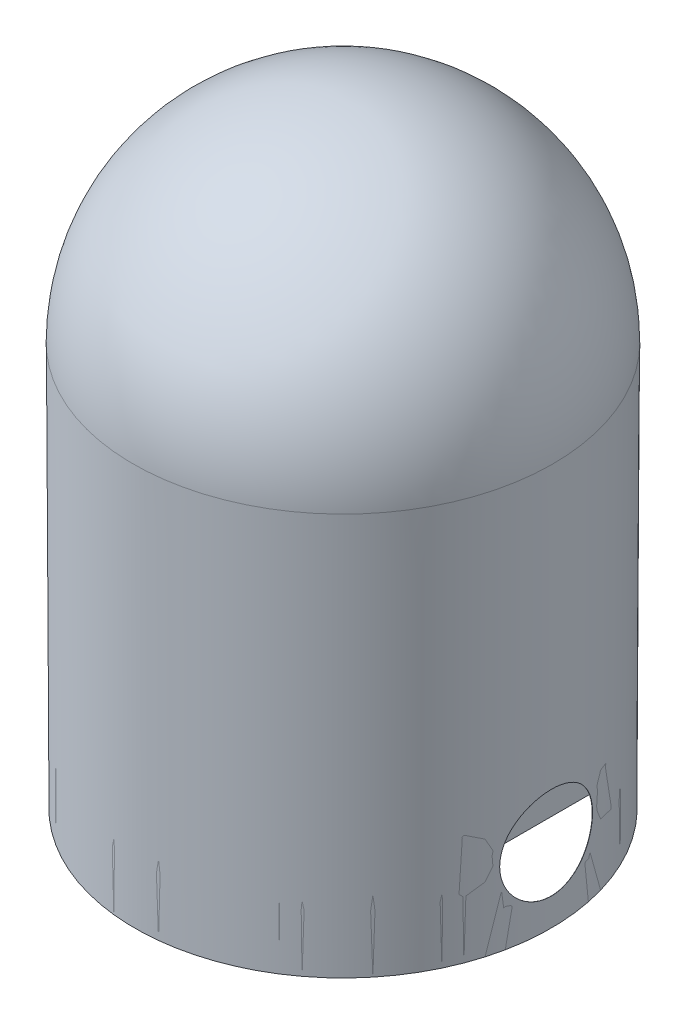
ISO-10303-21;
HEADER;
FILE_DESCRIPTION(('STEP AP214'),'2;1');
FILE_NAME('part.step','',(''),(''),'','','');
FILE_SCHEMA(('AUTOMOTIVE_DESIGN { 1 0 10303 214 1 1 1 1 }'));
ENDSEC;
DATA;
#1=APPLICATION_CONTEXT('core data for automotive mechanical design processes');
#2=APPLICATION_PROTOCOL_DEFINITION('international standard','automotive_design',2000,#1);
#3=PRODUCT_CONTEXT('',#1,'mechanical');
#4=PRODUCT('Part','Part','',(#3));
#5=PRODUCT_RELATED_PRODUCT_CATEGORY('part','',(#4));
#6=PRODUCT_DEFINITION_FORMATION('','',#4);
#7=PRODUCT_DEFINITION_CONTEXT('part definition',#1,'design');
#8=PRODUCT_DEFINITION('design','',#6,#7);
#9=PRODUCT_DEFINITION_SHAPE('','',#8);
#10=(LENGTH_UNIT() NAMED_UNIT(*) SI_UNIT(.MILLI.,.METRE.));
#11=(NAMED_UNIT(*) PLANE_ANGLE_UNIT() SI_UNIT($,.RADIAN.));
#12=(NAMED_UNIT(*) SI_UNIT($,.STERADIAN.) SOLID_ANGLE_UNIT());
#13=UNCERTAINTY_MEASURE_WITH_UNIT(LENGTH_MEASURE(1.E-05),#10,'distance_accuracy_value','');
#14=(GEOMETRIC_REPRESENTATION_CONTEXT(3) GLOBAL_UNCERTAINTY_ASSIGNED_CONTEXT((#13)) GLOBAL_UNIT_ASSIGNED_CONTEXT((#10,
#11,#12)) REPRESENTATION_CONTEXT('',''));
#15=CARTESIAN_POINT('',(0.,0.,0.));
#16=DIRECTION('',(0.,0.,1.));
#17=DIRECTION('',(1.,0.,0.));
#18=AXIS2_PLACEMENT_3D('',#15,#16,#17);
#19=CARTESIAN_POINT('',(0.,0.,0.));
#20=DIRECTION('',(0.,1.,0.));
#21=DIRECTION('',(0.,0.,1.));
#22=AXIS2_PLACEMENT_3D('',#19,#20,#21);
#23=PLANE('',#22);
#24=CARTESIAN_POINT('',(0.,0.,0.));
#25=DIRECTION('',(0.,-1.,0.));
#26=DIRECTION('',(0.,0.,-1.));
#27=AXIS2_PLACEMENT_3D('',#24,#25,#26);
#28=CIRCLE('',#27,14.224);
#29=CARTESIAN_POINT('',(2.54000000000001,0.,-13.9953769509792));
#30=VERTEX_POINT('',#29);
#31=CARTESIAN_POINT('',(7.62,0.,-12.0107358642175));
#32=VERTEX_POINT('',#31);
#33=EDGE_CURVE('E178',#30,#32,#28,.T.);
#34=ORIENTED_EDGE('',*,*,#33,.T.);
#35=DIRECTION('',(0.,0.,-1.));
#36=VECTOR('',#35,1.);
#37=CARTESIAN_POINT('',(7.62,0.,12.0107358642175));
#38=LINE('',#37,#36);
#39=CARTESIAN_POINT('',(7.62,0.,12.0107358642175));
#40=VERTEX_POINT('',#39);
#41=EDGE_CURVE('E135',#40,#32,#38,.T.);
#42=ORIENTED_EDGE('',*,*,#41,.F.);
#43=CARTESIAN_POINT('',(2.54,0.,13.9953769509792));
#44=VERTEX_POINT('',#43);
#45=EDGE_CURVE('E182',#40,#44,#28,.T.);
#46=ORIENTED_EDGE('',*,*,#45,.T.);
#47=DIRECTION('',(0.,0.,1.));
#48=VECTOR('',#47,1.);
#49=CARTESIAN_POINT('',(2.54,0.,13.9953769509792));
#50=LINE('',#49,#48);
#51=EDGE_CURVE('E151',#30,#44,#50,.T.);
#52=ORIENTED_EDGE('',*,*,#51,.F.);
#53=EDGE_LOOP('',(#34,#42,#46,#52));
#54=FACE_BOUND('',#53,.T.);
#55=ADVANCED_FACE('F35',(#54),#23,.F.);
#56=CARTESIAN_POINT('',(-2.54,0.,13.9953769509792));
#57=VERTEX_POINT('',#56);
#58=CARTESIAN_POINT('',(-7.62,0.,12.0107358642175));
#59=VERTEX_POINT('',#58);
#60=EDGE_CURVE('E401',#57,#59,#28,.T.);
#61=ORIENTED_EDGE('',*,*,#60,.T.);
#62=DIRECTION('',(0.,0.,1.));
#63=VECTOR('',#62,1.);
#64=CARTESIAN_POINT('',(-7.62,0.,12.0107358642175));
#65=LINE('',#64,#63);
#66=CARTESIAN_POINT('',(-7.62,0.,-12.0107358642175));
#67=VERTEX_POINT('',#66);
#68=EDGE_CURVE('E59',#67,#59,#65,.T.);
#69=ORIENTED_EDGE('',*,*,#68,.F.);
#70=CARTESIAN_POINT('',(-2.54,0.,-13.9953769509792));
#71=VERTEX_POINT('',#70);
#72=EDGE_CURVE('E172',#67,#71,#28,.T.);
#73=ORIENTED_EDGE('',*,*,#72,.T.);
#74=DIRECTION('',(0.,0.,-1.));
#75=VECTOR('',#74,1.);
#76=CARTESIAN_POINT('',(-2.54,0.,13.9953769509792));
#77=LINE('',#76,#75);
#78=EDGE_CURVE('E51',#57,#71,#77,.T.);
#79=ORIENTED_EDGE('',*,*,#78,.F.);
#80=EDGE_LOOP('',(#61,#69,#73,#79));
#81=FACE_BOUND('',#80,.T.);
#82=ADVANCED_FACE('F37',(#81),#23,.F.);
#83=CARTESIAN_POINT('',(0.,27.559,0.));
#84=DIRECTION('',(0.,-1.,0.));
#85=DIRECTION('',(-1.,0.,0.));
#86=AXIS2_PLACEMENT_3D('',#83,#84,#85);
#87=SPHERICAL_SURFACE('',#86,14.351);
#88=CARTESIAN_POINT('',(0.,27.559,0.));
#89=DIRECTION('',(0.,-1.,0.));
#90=DIRECTION('',(0.,0.,-1.));
#91=AXIS2_PLACEMENT_3D('',#88,#89,#90);
#92=CIRCLE('',#91,14.351);
#93=CARTESIAN_POINT('',(0.,27.559,-14.351));
#94=VERTEX_POINT('',#93);
#95=EDGE_CURVE('E181',#94,#94,#92,.T.);
#96=ORIENTED_EDGE('',*,*,#95,.F.);
#97=EDGE_LOOP('',(#96));
#98=FACE_BOUND('',#97,.T.);
#99=ADVANCED_FACE('F222',(#98),#87,.T.);
#100=CARTESIAN_POINT('',(0.,27.559,0.));
#101=DIRECTION('',(0.,1.,0.));
#102=DIRECTION('',(0.,0.,1.));
#103=AXIS2_PLACEMENT_3D('',#100,#101,#102);
#104=CONICAL_SURFACE('',#103,14.351,0.00460826231012028);
#105=CARTESIAN_POINT('',(14.0497008241268,2.89532698165526,-2.3038725665543));
#106=CARTESIAN_POINT('',(14.0691801413983,2.76617339641131,-2.18139446715179));
#107=CARTESIAN_POINT('',(14.0888518920256,2.64729976083629,-2.04800068410291));
#108=CARTESIAN_POINT('',(14.1263573665238,2.43341377098155,-1.76295051089078));
#109=CARTESIAN_POINT('',(14.144189857594,2.33841736039053,-1.61128201748954));
#110=CARTESIAN_POINT('',(14.1760050698291,2.17504353955398,-1.29373023481782));
#111=CARTESIAN_POINT('',(14.1899858694834,2.10667940845766,-1.12783990454742));
#112=CARTESIAN_POINT('',(14.2124853183673,1.99878667848915,-0.786610173351352));
#113=CARTESIAN_POINT('',(14.2210054280249,1.95925036940417,-0.611273312452413));
#114=CARTESIAN_POINT('',(14.2315258519271,1.91065016897221,-0.258873650042377));
#115=CARTESIAN_POINT('',(14.2336205069807,1.90114528259366,-0.0818744831295595));
#116=CARTESIAN_POINT('',(14.231320521346,1.91167759204344,0.271195743116567));
#117=CARTESIAN_POINT('',(14.226926127673,1.93171366335073,0.447266837522307));
#118=CARTESIAN_POINT('',(14.2122324197153,2.00026353118473,0.791375941732378));
#119=CARTESIAN_POINT('',(14.2020019862729,2.0484452900555,0.95948330656051));
#120=CARTESIAN_POINT('',(14.1768073501535,2.17153918305777,1.28522503562709));
#121=CARTESIAN_POINT('',(14.1618427670964,2.24645346516019,1.4428585570796));
#122=CARTESIAN_POINT('',(14.1285619961417,2.42207333165908,1.74559371404567));
#123=CARTESIAN_POINT('',(14.1102022775673,2.52312160591338,1.89049165174971));
#124=CARTESIAN_POINT('',(14.0722871741461,2.74771293482754,2.16149071667169));
#125=CARTESIAN_POINT('',(14.0527316335434,2.87125892397794,2.28758938789953));
#126=CARTESIAN_POINT('',(14.0142321460127,3.14008423087274,2.51981706878363));
#127=CARTESIAN_POINT('',(13.995306296375,3.28572448576985,2.62553182428115));
#128=CARTESIAN_POINT('',(13.9606818746617,3.59304133667862,2.81101140395865));
#129=CARTESIAN_POINT('',(13.9449831645575,3.75471724638812,2.89077733808476));
#130=CARTESIAN_POINT('',(13.9188073471691,4.08863970960474,3.02155436274061));
#131=CARTESIAN_POINT('',(13.9083006220708,4.26081985866895,3.07272877835894));
#132=CARTESIAN_POINT('',(13.8937145100689,4.61159315519827,3.14535933270135));
#133=CARTESIAN_POINT('',(13.8896340518137,4.79018522862406,3.16682042499395));
#134=CARTESIAN_POINT('',(13.8884845408357,5.14444218524899,3.17918011949429));
#135=CARTESIAN_POINT('',(13.8912611046524,5.32008348972589,3.17074984552197));
#136=CARTESIAN_POINT('',(13.9032393080903,5.66735261329487,3.12510986507102));
#137=CARTESIAN_POINT('',(13.9124408799015,5.83898047472532,3.08790046232877));
#138=CARTESIAN_POINT('',(13.9362212510777,6.17285351424144,2.9860777379085));
#139=CARTESIAN_POINT('',(13.9507818561938,6.33512831515081,2.92155702981745));
#140=CARTESIAN_POINT('',(13.9837109055119,6.64663841301904,2.76703968063862));
#141=CARTESIAN_POINT('',(14.0020798442875,6.79587201278534,2.67703973010384));
#142=CARTESIAN_POINT('',(14.0411018614368,7.08050533614093,2.4718488022663));
#143=CARTESIAN_POINT('',(14.0617954036713,7.21554073233196,2.35616001729031));
#144=CARTESIAN_POINT('',(14.1029060376351,7.46448350709255,2.10387147093172));
#145=CARTESIAN_POINT('',(14.1233231024535,7.57838884247704,1.96726968968191));
#146=CARTESIAN_POINT('',(14.1619552469046,7.78334275049572,1.6747756072605));
#147=CARTESIAN_POINT('',(14.180136949151,7.87406266094281,1.51864817899191));
#148=CARTESIAN_POINT('',(14.2119561030027,8.02788693737559,1.19290392495821));
#149=CARTESIAN_POINT('',(14.2255940475335,8.09099429911672,1.02328856489377));
#150=CARTESIAN_POINT('',(14.2466360252027,8.18685718378398,0.678005153090687));
#151=CARTESIAN_POINT('',(14.2541287559316,8.22004527175304,0.502462739679212));
#152=CARTESIAN_POINT('',(14.2623791510131,8.25653613387966,0.14815185320788));
#153=CARTESIAN_POINT('',(14.2631377238854,8.25984293938634,-0.0306161814155235));
#154=CARTESIAN_POINT('',(14.2578916499227,8.23670543890802,-0.382502486237278));
#155=CARTESIAN_POINT('',(14.2520219902008,8.21085494745931,-0.555662238678417));
#156=CARTESIAN_POINT('',(14.2343683084411,8.13119778634395,-0.895104454041886));
#157=CARTESIAN_POINT('',(14.2225841272374,8.07739036432599,-1.0613867317539));
#158=CARTESIAN_POINT('',(14.1942814762813,7.94316505780718,-1.38327905479009));
#159=CARTESIAN_POINT('',(14.1777418033964,7.86262773983603,-1.53883734625174));
#160=CARTESIAN_POINT('',(14.1416789660959,7.67731533785482,-1.83439737483622));
#161=CARTESIAN_POINT('',(14.1221553770825,7.57253680333705,-1.97439689311136));
#162=CARTESIAN_POINT('',(14.0816956100968,7.33894664065291,-2.23819377841141));
#163=CARTESIAN_POINT('',(14.0607375835067,7.20964914486582,-2.36155785487114));
#164=CARTESIAN_POINT('',(14.0200847090824,6.93209123888865,-2.58498068401012));
#165=CARTESIAN_POINT('',(14.0003899394761,6.7838296560358,-2.68503799441251));
#166=CARTESIAN_POINT('',(13.9643037968517,6.47113328297711,-2.85966272257627));
#167=CARTESIAN_POINT('',(13.9479379439594,6.30658694343021,-2.93403606221196));
#168=CARTESIAN_POINT('',(13.9205780382497,5.96688303076249,-3.05393059371665));
#169=CARTESIAN_POINT('',(13.9095830564026,5.79172729870379,-3.09945677584591));
#170=CARTESIAN_POINT('',(13.8943910990163,5.43942732826681,-3.15954794790237));
#171=CARTESIAN_POINT('',(13.8900654040231,5.26238893892933,-3.17470092395659));
#172=CARTESIAN_POINT('',(13.8882567105398,4.90821332533649,-3.17529022498424));
#173=CARTESIAN_POINT('',(13.8907738935643,4.73107609858396,-3.16072576167363));
#174=CARTESIAN_POINT('',(13.9021829332867,4.38470783066122,-3.10282915457713));
#175=CARTESIAN_POINT('',(13.910972914819,4.21539590500112,-3.05995756224739));
#176=CARTESIAN_POINT('',(13.9337362654291,3.88645483414481,-2.94724824765736));
#177=CARTESIAN_POINT('',(13.9477068581414,3.72682055577338,-2.87742496838249));
#178=CARTESIAN_POINT('',(13.9761856070528,3.45066422216324,-2.72866021554564));
#179=CARTESIAN_POINT('',(13.9900798733428,3.33173608571289,-2.65401700772292));
#180=CARTESIAN_POINT('',(14.0191766369608,3.10486059125785,-2.48979166817852));
#181=CARTESIAN_POINT('',(14.0343792037777,2.99691381718148,-2.40020874271281));
#182=CARTESIAN_POINT('',(14.0497008241268,2.89532698165526,-2.3038725665543));
#183=B_SPLINE_CURVE_WITH_KNOTS('',3,(#105,#106,#107,#108,#109,#110,#111,#112,#113,#114,#115,
#116,#117,#118,#119,#120,#121,#122,#123,#124,#125,#126,#127,#128,#129,#130,#131,#132,#133,#134,
#135,#136,#137,#138,#139,#140,#141,#142,#143,#144,#145,#146,#147,#148,#149,#150,#151,#152,#153,
#154,#155,#156,#157,#158,#159,#160,#161,#162,#163,#164,#165,#166,#167,#168,#169,#170,#171,#172,
#173,#174,#175,#176,#177,#178,#179,#180,#181,#182),.UNSPECIFIED.,.T.,.F.,(4,2,2,2,2,2,2,2,2,2,2,
2,2,2,2,2,2,2,2,2,2,2,2,2,2,2,2,2,2,2,2,2,2,2,2,2,2,2,4),(0.,0.536668477704947,1.07369436205403,
1.61098767177501,2.14813722568862,2.67736146861658,3.20656556634695,3.72964918180243,
4.2527748367418,4.78314248588757,5.31357936317985,5.85386501296566,6.39412754929915,
6.9312715037037,7.46832589896094,7.99339939748555,8.51846735443368,9.04176887410123,
9.56513839554863,10.0997064569918,10.6343261819305,11.176149595808,11.7179142113043,
12.2517143188429,12.7854424091669,13.3084938648801,13.8315593972039,14.3569942612491,
14.8825039620378,15.4197877975679,15.9571048726426,16.4983975717466,17.0395966072225,
17.5702134389128,18.1008443459147,18.623047964464,19.1449721299384,19.5670707882964,
19.989191879815),.UNSPECIFIED.);
#184=CARTESIAN_POINT('',(14.0497008241268,2.89532698165526,-2.3038725665543));
#185=VERTEX_POINT('',#184);
#186=EDGE_CURVE('E142',#185,#185,#183,.T.);
#187=ORIENTED_EDGE('',*,*,#186,.T.);
#188=EDGE_LOOP('',(#187));
#189=FACE_BOUND('',#188,.T.);
#190=ORIENTED_EDGE('',*,*,#33,.F.);
#191=CARTESIAN_POINT('',(0.,0.,0.));
#192=DIRECTION('',(0.,-1.,0.));
#193=DIRECTION('',(0.,0.,-1.));
#194=AXIS2_PLACEMENT_3D('',#191,#192,#193);
#195=CIRCLE('',#194,14.224);
#196=EDGE_CURVE('E165',#71,#30,#195,.T.);
#197=ORIENTED_EDGE('',*,*,#196,.F.);
#198=ORIENTED_EDGE('',*,*,#72,.F.);
#199=CARTESIAN_POINT('',(0.,0.,0.));
#200=DIRECTION('',(0.,-1.,0.));
#201=DIRECTION('',(0.,0.,-1.));
#202=AXIS2_PLACEMENT_3D('',#199,#200,#201);
#203=CIRCLE('',#202,14.224);
#204=EDGE_CURVE('E114',#59,#67,#203,.T.);
#205=ORIENTED_EDGE('',*,*,#204,.F.);
#206=ORIENTED_EDGE('',*,*,#60,.F.);
#207=CARTESIAN_POINT('',(0.,0.,0.));
#208=DIRECTION('',(0.,-1.,0.));
#209=DIRECTION('',(0.,0.,-1.));
#210=AXIS2_PLACEMENT_3D('',#207,#208,#209);
#211=CIRCLE('',#210,14.224);
#212=EDGE_CURVE('E129',#44,#57,#211,.T.);
#213=ORIENTED_EDGE('',*,*,#212,.F.);
#214=ORIENTED_EDGE('',*,*,#45,.F.);
#215=CARTESIAN_POINT('',(0.,0.,0.));
#216=DIRECTION('',(0.,-1.,0.));
#217=DIRECTION('',(0.,0.,-1.));
#218=AXIS2_PLACEMENT_3D('',#215,#216,#217);
#219=CIRCLE('',#218,14.224);
#220=EDGE_CURVE('E139',#32,#40,#219,.T.);
#221=ORIENTED_EDGE('',*,*,#220,.F.);
#222=EDGE_LOOP('',(#190,#197,#198,#205,#206,#213,#214,#221));
#223=FACE_BOUND('',#222,.T.);
#224=ORIENTED_EDGE('',*,*,#95,.T.);
#225=EDGE_LOOP('',(#224));
#226=FACE_BOUND('',#225,.T.);
#227=ADVANCED_FACE('F232',(#189,#223,#226),#104,.T.);
#228=CARTESIAN_POINT('',(0.,10.16,0.));
#229=DIRECTION('',(0.,-1.,0.));
#230=DIRECTION('',(0.,0.,-1.));
#231=AXIS2_PLACEMENT_3D('',#228,#229,#230);
#232=PLANE('',#231);
#233=CARTESIAN_POINT('',(0.,10.16,0.));
#234=DIRECTION('',(0.,-1.,0.));
#235=DIRECTION('',(0.,0.,-1.));
#236=AXIS2_PLACEMENT_3D('',#233,#234,#235);
#237=CIRCLE('',#236,2.54);
#238=CARTESIAN_POINT('',(-2.54,10.16,0.));
#239=VERTEX_POINT('',#238);
#240=CARTESIAN_POINT('',(2.54,10.16,0.));
#241=VERTEX_POINT('',#240);
#242=EDGE_CURVE('E11',#239,#241,#237,.F.);
#243=ORIENTED_EDGE('',*,*,#242,.T.);
#244=DIRECTION('',(0.,0.,1.));
#245=VECTOR('',#244,1.);
#246=CARTESIAN_POINT('',(2.54,10.16,13.9953769509792));
#247=LINE('',#246,#245);
#248=CARTESIAN_POINT('',(2.54,10.16,13.9953769509792));
#249=VERTEX_POINT('',#248);
#250=EDGE_CURVE('E158',#241,#249,#247,.T.);
#251=ORIENTED_EDGE('',*,*,#250,.T.);
#252=CARTESIAN_POINT('',(0.,10.16,0.));
#253=DIRECTION('',(0.,-1.,0.));
#254=DIRECTION('',(0.,0.,-1.));
#255=AXIS2_PLACEMENT_3D('',#252,#253,#254);
#256=CIRCLE('',#255,14.224);
#257=CARTESIAN_POINT('',(-2.54,10.16,13.9953769509792));
#258=VERTEX_POINT('',#257);
#259=EDGE_CURVE('E147',#249,#258,#256,.T.);
#260=ORIENTED_EDGE('',*,*,#259,.T.);
#261=DIRECTION('',(0.,0.,-1.));
#262=VECTOR('',#261,1.);
#263=CARTESIAN_POINT('',(-2.54,10.16,13.9953769509792));
#264=LINE('',#263,#262);
#265=EDGE_CURVE('E152',#258,#239,#264,.T.);
#266=ORIENTED_EDGE('',*,*,#265,.T.);
#267=EDGE_LOOP('',(#243,#251,#260,#266));
#268=FACE_BOUND('',#267,.T.);
#269=ADVANCED_FACE('F199',(#268),#232,.T.);
#270=EDGE_CURVE('E44',#241,#239,#237,.F.);
#271=ORIENTED_EDGE('',*,*,#270,.T.);
#272=CARTESIAN_POINT('',(-2.54,10.16,-13.9953769509792));
#273=VERTEX_POINT('',#272);
#274=EDGE_CURVE('E150',#239,#273,#264,.T.);
#275=ORIENTED_EDGE('',*,*,#274,.T.);
#276=CARTESIAN_POINT('',(0.,10.16,0.));
#277=DIRECTION('',(0.,-1.,0.));
#278=DIRECTION('',(0.,0.,-1.));
#279=AXIS2_PLACEMENT_3D('',#276,#277,#278);
#280=CIRCLE('',#279,14.224);
#281=CARTESIAN_POINT('',(2.54000000000001,10.16,-13.9953769509792));
#282=VERTEX_POINT('',#281);
#283=EDGE_CURVE('E155',#273,#282,#280,.T.);
#284=ORIENTED_EDGE('',*,*,#283,.T.);
#285=EDGE_CURVE('E159',#282,#241,#247,.T.);
#286=ORIENTED_EDGE('',*,*,#285,.T.);
#287=EDGE_LOOP('',(#271,#275,#284,#286));
#288=FACE_BOUND('',#287,.T.);
#289=ADVANCED_FACE('F190',(#288),#232,.T.);
#290=CARTESIAN_POINT('',(0.,10.16,0.));
#291=DIRECTION('',(0.,-1.,0.));
#292=DIRECTION('',(0.,0.,-1.));
#293=AXIS2_PLACEMENT_3D('',#290,#291,#292);
#294=CYLINDRICAL_SURFACE('',#293,14.224);
#295=ORIENTED_EDGE('',*,*,#212,.T.);
#296=DIRECTION('',(0.,-1.,0.));
#297=VECTOR('',#296,1.);
#298=CARTESIAN_POINT('',(-2.54,10.16,13.9953769509792));
#299=LINE('',#298,#297);
#300=EDGE_CURVE('E161',#258,#57,#299,.T.);
#301=ORIENTED_EDGE('',*,*,#300,.F.);
#302=ORIENTED_EDGE('',*,*,#259,.F.);
#303=DIRECTION('',(0.,-1.,0.));
#304=VECTOR('',#303,1.);
#305=CARTESIAN_POINT('',(2.54,10.16,13.9953769509792));
#306=LINE('',#305,#304);
#307=EDGE_CURVE('E170',#249,#44,#306,.T.);
#308=ORIENTED_EDGE('',*,*,#307,.T.);
#309=EDGE_LOOP('',(#295,#301,#302,#308));
#310=FACE_BOUND('',#309,.T.);
#311=ADVANCED_FACE('F286',(#310),#294,.F.);
#312=CARTESIAN_POINT('',(2.54,10.16,13.9953769509792));
#313=DIRECTION('',(1.,0.,0.));
#314=DIRECTION('',(0.,0.,-1.));
#315=AXIS2_PLACEMENT_3D('',#312,#313,#314);
#316=PLANE('',#315);
#317=CARTESIAN_POINT('',(2.54,5.08,0.));
#318=DIRECTION('',(1.,0.,0.));
#319=DIRECTION('',(0.,0.,-1.));
#320=AXIS2_PLACEMENT_3D('',#317,#318,#319);
#321=CIRCLE('',#320,3.175);
#322=CARTESIAN_POINT('',(2.54,5.08,3.175));
#323=VERTEX_POINT('',#322);
#324=EDGE_CURVE('E280',#323,#323,#321,.T.);
#325=ORIENTED_EDGE('',*,*,#324,.T.);
#326=EDGE_LOOP('',(#325));
#327=FACE_BOUND('',#326,.T.);
#328=ORIENTED_EDGE('',*,*,#250,.F.);
#329=ORIENTED_EDGE('',*,*,#285,.F.);
#330=DIRECTION('',(0.,-1.,0.));
#331=VECTOR('',#330,1.);
#332=CARTESIAN_POINT('',(2.54000000000001,10.16,-13.9953769509792));
#333=LINE('',#332,#331);
#334=EDGE_CURVE('E173',#282,#30,#333,.T.);
#335=ORIENTED_EDGE('',*,*,#334,.T.);
#336=ORIENTED_EDGE('',*,*,#51,.T.);
#337=ORIENTED_EDGE('',*,*,#307,.F.);
#338=EDGE_LOOP('',(#328,#329,#335,#336,#337));
#339=FACE_BOUND('',#338,.T.);
#340=ADVANCED_FACE('F317',(#327,#339),#316,.F.);
#341=CARTESIAN_POINT('',(0.,10.16,0.));
#342=DIRECTION('',(0.,-1.,0.));
#343=DIRECTION('',(0.,0.,-1.));
#344=AXIS2_PLACEMENT_3D('',#341,#342,#343);
#345=CYLINDRICAL_SURFACE('',#344,14.224);
#346=ORIENTED_EDGE('',*,*,#196,.T.);
#347=ORIENTED_EDGE('',*,*,#334,.F.);
#348=ORIENTED_EDGE('',*,*,#283,.F.);
#349=DIRECTION('',(0.,-1.,0.));
#350=VECTOR('',#349,1.);
#351=CARTESIAN_POINT('',(-2.54,10.16,-13.9953769509792));
#352=LINE('',#351,#350);
#353=EDGE_CURVE('E175',#273,#71,#352,.T.);
#354=ORIENTED_EDGE('',*,*,#353,.T.);
#355=EDGE_LOOP('',(#346,#347,#348,#354));
#356=FACE_BOUND('',#355,.T.);
#357=ADVANCED_FACE('F324',(#356),#345,.F.);
#358=CARTESIAN_POINT('',(-2.54,10.16,13.9953769509792));
#359=DIRECTION('',(-1.,0.,0.));
#360=DIRECTION('',(0.,0.,1.));
#361=AXIS2_PLACEMENT_3D('',#358,#359,#360);
#362=PLANE('',#361);
#363=CARTESIAN_POINT('',(-2.54,5.08,0.));
#364=DIRECTION('',(-1.,0.,0.));
#365=DIRECTION('',(0.,0.,1.));
#366=AXIS2_PLACEMENT_3D('',#363,#364,#365);
#367=CIRCLE('',#366,3.175);
#368=CARTESIAN_POINT('',(-2.54,5.08,3.175));
#369=VERTEX_POINT('',#368);
#370=EDGE_CURVE('E264',#369,#369,#367,.T.);
#371=ORIENTED_EDGE('',*,*,#370,.T.);
#372=EDGE_LOOP('',(#371));
#373=FACE_BOUND('',#372,.T.);
#374=ORIENTED_EDGE('',*,*,#274,.F.);
#375=ORIENTED_EDGE('',*,*,#265,.F.);
#376=ORIENTED_EDGE('',*,*,#300,.T.);
#377=ORIENTED_EDGE('',*,*,#78,.T.);
#378=ORIENTED_EDGE('',*,*,#353,.F.);
#379=EDGE_LOOP('',(#374,#375,#376,#377,#378));
#380=FACE_BOUND('',#379,.T.);
#381=ADVANCED_FACE('F196',(#373,#380),#362,.F.);
#382=CARTESIAN_POINT('',(0.,10.16,0.));
#383=DIRECTION('',(0.,-1.,0.));
#384=DIRECTION('',(0.,0.,-1.));
#385=AXIS2_PLACEMENT_3D('',#382,#383,#384);
#386=CYLINDRICAL_SURFACE('',#385,14.224);
#387=ORIENTED_EDGE('',*,*,#204,.T.);
#388=DIRECTION('',(0.,-1.,0.));
#389=VECTOR('',#388,1.);
#390=CARTESIAN_POINT('',(-7.62,10.16,-12.0107358642175));
#391=LINE('',#390,#389);
#392=CARTESIAN_POINT('',(-7.62,10.16,-12.0107358642175));
#393=VERTEX_POINT('',#392);
#394=EDGE_CURVE('E108',#393,#67,#391,.T.);
#395=ORIENTED_EDGE('',*,*,#394,.F.);
#396=CARTESIAN_POINT('',(0.,10.16,0.));
#397=DIRECTION('',(0.,-1.,0.));
#398=DIRECTION('',(0.,0.,-1.));
#399=AXIS2_PLACEMENT_3D('',#396,#397,#398);
#400=CIRCLE('',#399,14.224);
#401=CARTESIAN_POINT('',(-7.62,10.16,12.0107358642175));
#402=VERTEX_POINT('',#401);
#403=EDGE_CURVE('E111',#402,#393,#400,.T.);
#404=ORIENTED_EDGE('',*,*,#403,.F.);
#405=DIRECTION('',(0.,-1.,0.));
#406=VECTOR('',#405,1.);
#407=CARTESIAN_POINT('',(-7.62,10.16,12.0107358642175));
#408=LINE('',#407,#406);
#409=EDGE_CURVE('E116',#402,#59,#408,.T.);
#410=ORIENTED_EDGE('',*,*,#409,.T.);
#411=EDGE_LOOP('',(#387,#395,#404,#410));
#412=FACE_BOUND('',#411,.T.);
#413=ADVANCED_FACE('F110',(#412),#386,.F.);
#414=CARTESIAN_POINT('',(-7.62,10.16,12.0107358642175));
#415=DIRECTION('',(1.,0.,0.));
#416=DIRECTION('',(0.,0.,-1.));
#417=AXIS2_PLACEMENT_3D('',#414,#415,#416);
#418=PLANE('',#417);
#419=CARTESIAN_POINT('',(-7.62,5.08,0.));
#420=DIRECTION('',(-1.,0.,0.));
#421=DIRECTION('',(0.,0.,1.));
#422=AXIS2_PLACEMENT_3D('',#419,#420,#421);
#423=CIRCLE('',#422,3.175);
#424=CARTESIAN_POINT('',(-7.62,5.08,3.175));
#425=VERTEX_POINT('',#424);
#426=EDGE_CURVE('E265',#425,#425,#423,.T.);
#427=ORIENTED_EDGE('',*,*,#426,.F.);
#428=EDGE_LOOP('',(#427));
#429=FACE_BOUND('',#428,.T.);
#430=ORIENTED_EDGE('',*,*,#68,.T.);
#431=ORIENTED_EDGE('',*,*,#409,.F.);
#432=DIRECTION('',(0.,0.,1.));
#433=VECTOR('',#432,1.);
#434=CARTESIAN_POINT('',(-7.62,10.16,12.0107358642175));
#435=LINE('',#434,#433);
#436=EDGE_CURVE('E117',#393,#402,#435,.T.);
#437=ORIENTED_EDGE('',*,*,#436,.F.);
#438=ORIENTED_EDGE('',*,*,#394,.T.);
#439=EDGE_LOOP('',(#430,#431,#437,#438));
#440=FACE_BOUND('',#439,.T.);
#441=ADVANCED_FACE('F122',(#429,#440),#418,.F.);
#442=CARTESIAN_POINT('',(0.,10.16,0.));
#443=DIRECTION('',(0.,-1.,0.));
#444=DIRECTION('',(0.,0.,-1.));
#445=AXIS2_PLACEMENT_3D('',#442,#443,#444);
#446=PLANE('',#445);
#447=ORIENTED_EDGE('',*,*,#403,.T.);
#448=ORIENTED_EDGE('',*,*,#436,.T.);
#449=EDGE_LOOP('',(#447,#448));
#450=FACE_BOUND('',#449,.T.);
#451=ADVANCED_FACE('F120',(#450),#446,.T.);
#452=CARTESIAN_POINT('',(0.,10.16,0.));
#453=DIRECTION('',(0.,-1.,0.));
#454=DIRECTION('',(0.,0.,-1.));
#455=AXIS2_PLACEMENT_3D('',#452,#453,#454);
#456=CYLINDRICAL_SURFACE('',#455,14.224);
#457=CARTESIAN_POINT('',(13.865119941782,5.08,3.175));
#458=CARTESIAN_POINT('',(13.8651234945156,4.9040591854465,3.17499407535695));
#459=CARTESIAN_POINT('',(13.8685053207699,4.72804797599462,3.16032575788681));
#460=CARTESIAN_POINT('',(13.8816410745119,4.38103763328818,3.10210819342643));
#461=CARTESIAN_POINT('',(13.8913994855765,4.21004211518568,3.05853862473354));
#462=CARTESIAN_POINT('',(13.9161294021383,3.87813288518564,2.94396428790258));
#463=CARTESIAN_POINT('',(13.9310950498815,3.71720808347626,2.87299033785441));
#464=CARTESIAN_POINT('',(13.9645461096854,3.40954420195906,2.70571097175899));
#465=CARTESIAN_POINT('',(13.9830314800008,3.26280495393632,2.60940585614377));
#466=CARTESIAN_POINT('',(14.0218024220076,2.98509542066883,2.39239222854829));
#467=CARTESIAN_POINT('',(14.0421118258716,2.85441097875573,2.2713221198961));
#468=CARTESIAN_POINT('',(14.0820341003482,2.6150261473464,2.00899561673467));
#469=CARTESIAN_POINT('',(14.1016469153105,2.50632751105296,1.86773761392417));
#470=CARTESIAN_POINT('',(14.1382262993735,2.31286385241336,1.56712290056821));
#471=CARTESIAN_POINT('',(14.1551614669343,2.22837456534889,1.40758458781741));
#472=CARTESIAN_POINT('',(14.1842078532174,2.08751305978815,1.07613249597818));
#473=CARTESIAN_POINT('',(14.1963196360738,2.03113755296193,0.904220166910238));
#474=CARTESIAN_POINT('',(14.2141861616249,1.94900518717684,0.555873288731483));
#475=CARTESIAN_POINT('',(14.2200412871429,1.92276431414988,0.379558095007355));
#476=CARTESIAN_POINT('',(14.2250828546405,1.90013197522174,0.0249373469486592));
#477=CARTESIAN_POINT('',(14.2242700898324,1.90373695885756,-0.153367968120971));
#478=CARTESIAN_POINT('',(14.2161439010455,1.94033519328935,-0.503568139008647));
#479=CARTESIAN_POINT('',(14.2089459038672,1.97280664283349,-0.675520600298373));
#480=CARTESIAN_POINT('',(14.1889899180731,2.06538358045552,-1.01147230372771));
#481=CARTESIAN_POINT('',(14.1762316713344,2.12549035145226,-1.17547117624585));
#482=CARTESIAN_POINT('',(14.1464043121052,2.27208784818175,-1.49229882533211));
#483=CARTESIAN_POINT('',(14.1293033215994,2.35877470677103,-1.64503372633017));
#484=CARTESIAN_POINT('',(14.0926629151541,2.55592508681093,-1.93397811315378));
#485=CARTESIAN_POINT('',(14.0731231543915,2.66639197217597,-2.07018525670145));
#486=CARTESIAN_POINT('',(14.0332517835942,2.91080174601506,-2.32531252235383));
#487=CARTESIAN_POINT('',(14.0129121892103,3.04520127042905,-2.4437943401268));
#488=CARTESIAN_POINT('',(13.9741287627658,3.33217302354304,-2.65662160056898));
#489=CARTESIAN_POINT('',(13.9556849865069,3.48474578687132,-2.75096633290572));
#490=CARTESIAN_POINT('',(13.9227592349351,3.80446195203007,-2.91304744496858));
#491=CARTESIAN_POINT('',(13.9082900908072,3.97165029944787,-2.98069794827456));
#492=CARTESIAN_POINT('',(13.8851274787673,4.31542254604575,-3.08680927281865));
#493=CARTESIAN_POINT('',(13.8764330525054,4.49200488097949,-3.12527493761101));
#494=CARTESIAN_POINT('',(13.8660005623941,4.84553944341968,-3.17123847368995));
#495=CARTESIAN_POINT('',(13.8641188613183,5.02240438257104,-3.17937588576906));
#496=CARTESIAN_POINT('',(13.8671369274071,5.37496372851394,-3.16618605786013));
#497=CARTESIAN_POINT('',(13.8720362077788,5.55065821841989,-3.14486093292812));
#498=CARTESIAN_POINT('',(13.8879282917098,5.8936426742416,-3.07390709641346));
#499=CARTESIAN_POINT('',(13.8988446308658,6.06100993995891,-3.02463333063382));
#500=CARTESIAN_POINT('',(13.9254713670187,6.38511269855209,-2.89956647045562));
#501=CARTESIAN_POINT('',(13.9411822384029,6.54184713750339,-2.823770751776));
#502=CARTESIAN_POINT('',(13.9759416047062,6.8429949200022,-2.64641218951554));
#503=CARTESIAN_POINT('',(13.995039421953,6.98717135455633,-2.54445695042474));
#504=CARTESIAN_POINT('',(14.0342920314755,7.25660358124716,-2.31818454115648));
#505=CARTESIAN_POINT('',(14.0544469604884,7.38185691751395,-2.19386447301468));
#506=CARTESIAN_POINT('',(14.0940181443895,7.6123844626081,-1.92349169014136));
#507=CARTESIAN_POINT('',(14.1134123502848,7.71722176178601,-1.77706267267126));
#508=CARTESIAN_POINT('',(14.1488649544606,7.900810341393,-1.46830102978601));
#509=CARTESIAN_POINT('',(14.1649235118401,7.979562866083,-1.305969163426));
#510=CARTESIAN_POINT('',(14.1918028074616,8.1081452442169,-0.971041602397462));
#511=CARTESIAN_POINT('',(14.2026574062323,8.15816250375472,-0.798520696556254));
#512=CARTESIAN_POINT('',(14.2180524436401,8.22843723944367,-0.447254420112697));
#513=CARTESIAN_POINT('',(14.2225938403511,8.24869923119731,-0.268509998194928));
#514=CARTESIAN_POINT('',(14.2248208784312,8.25867821601519,0.085987890557851));
#515=CARTESIAN_POINT('',(14.222652691134,8.24904644472842,0.261722420618567));
#516=CARTESIAN_POINT('',(14.2120188433531,8.20097273435666,0.60900068507654));
#517=CARTESIAN_POINT('',(14.2035533053258,8.16253135549418,0.78054450089812));
#518=CARTESIAN_POINT('',(14.1812884183127,8.05824712979743,1.1140437071868));
#519=CARTESIAN_POINT('',(14.1675077430625,7.99250015462347,1.27603040277883));
#520=CARTESIAN_POINT('',(14.1360811874271,7.83556321250782,1.58675803995835));
#521=CARTESIAN_POINT('',(14.1184349153365,7.7443706668811,1.7354976370524));
#522=CARTESIAN_POINT('',(14.0807655756531,7.53702633548744,2.01867396695439));
#523=CARTESIAN_POINT('',(14.0607025685329,7.42041868830085,2.15277162854097));
#524=CARTESIAN_POINT('',(14.0206709733789,7.1664691557445,2.39971824165829));
#525=CARTESIAN_POINT('',(14.0007024094114,7.02912225122567,2.51256203460041));
#526=CARTESIAN_POINT('',(13.962806852764,6.73527084781723,2.71533014635573));
#527=CARTESIAN_POINT('',(13.9449124975013,6.57852422978126,2.80491005566963));
#528=CARTESIAN_POINT('',(13.9136052259768,6.25183265742766,2.95631326655731));
#529=CARTESIAN_POINT('',(13.9001885895919,6.08189880458014,3.01815962413209));
#530=CARTESIAN_POINT('',(13.8817854126926,5.77320841797603,3.10154296882424));
#531=CARTESIAN_POINT('',(13.8755780609757,5.63610233967595,3.1290355936315));
#532=CARTESIAN_POINT('',(13.867244022989,5.3593455436815,3.16576597865214));
#533=CARTESIAN_POINT('',(13.8651171209528,5.21969496092991,3.17500470409769));
#534=CARTESIAN_POINT('',(13.865119941782,5.08,3.175));
#535=B_SPLINE_CURVE_WITH_KNOTS('',3,(#457,#458,#459,#460,#461,#462,#463,#464,#465,#466,#467,
#468,#469,#470,#471,#472,#473,#474,#475,#476,#477,#478,#479,#480,#481,#482,#483,#484,#485,#486,
#487,#488,#489,#490,#491,#492,#493,#494,#495,#496,#497,#498,#499,#500,#501,#502,#503,#504,#505,
#506,#507,#508,#509,#510,#511,#512,#513,#514,#515,#516,#517,#518,#519,#520,#521,#522,#523,#524,
#525,#526,#527,#528,#529,#530,#531,#532,#533,#534),.UNSPECIFIED.,.T.,.F.,(4,2,2,2,2,2,2,2,2,2,2,
2,2,2,2,2,2,2,2,2,2,2,2,2,2,2,2,2,2,2,2,2,2,2,2,2,2,2,4),(0.,0.527310340388299,1.05499184875421,
1.58208166362553,2.10916522740181,2.64457830603297,3.18003406301588,3.72136585795697,
4.26263432113343,4.79508182884535,5.32746599751379,5.8504179565088,6.37339419503608,
6.90032629927443,7.42733299218698,7.96575385692394,8.50419056507505,9.04434559302816,
9.58441095652093,10.1130211983425,10.641593494274,11.163598617601,11.6856554066451,
12.2160544860429,12.7465223424565,13.2873276883152,13.8281072336863,14.3653186634415,
14.9024485585901,15.4279598445634,15.953460911876,16.4771323046345,17.0008567861743,
17.5348877406852,18.069048144851,18.6107158620307,19.1519324307216,19.5706328501584,
19.9893111289047),.UNSPECIFIED.);
#536=CARTESIAN_POINT('',(13.865119941782,5.08,3.175));
#537=VERTEX_POINT('',#536);
#538=EDGE_CURVE('E256',#537,#537,#535,.T.);
#539=ORIENTED_EDGE('',*,*,#538,.T.);
#540=EDGE_LOOP('',(#539));
#541=FACE_BOUND('',#540,.T.);
#542=ORIENTED_EDGE('',*,*,#220,.T.);
#543=DIRECTION('',(0.,-1.,0.));
#544=VECTOR('',#543,1.);
#545=CARTESIAN_POINT('',(7.62,10.16,12.0107358642175));
#546=LINE('',#545,#544);
#547=CARTESIAN_POINT('',(7.62,10.16,12.0107358642175));
#548=VERTEX_POINT('',#547);
#549=EDGE_CURVE('E138',#548,#40,#546,.T.);
#550=ORIENTED_EDGE('',*,*,#549,.F.);
#551=CARTESIAN_POINT('',(0.,10.16,0.));
#552=DIRECTION('',(0.,-1.,0.));
#553=DIRECTION('',(0.,0.,-1.));
#554=AXIS2_PLACEMENT_3D('',#551,#552,#553);
#555=CIRCLE('',#554,14.224);
#556=CARTESIAN_POINT('',(7.62,10.16,-12.0107358642175));
#557=VERTEX_POINT('',#556);
#558=EDGE_CURVE('E131',#557,#548,#555,.T.);
#559=ORIENTED_EDGE('',*,*,#558,.F.);
#560=DIRECTION('',(0.,-1.,0.));
#561=VECTOR('',#560,1.);
#562=CARTESIAN_POINT('',(7.62,10.16,-12.0107358642175));
#563=LINE('',#562,#561);
#564=EDGE_CURVE('E127',#557,#32,#563,.T.);
#565=ORIENTED_EDGE('',*,*,#564,.T.);
#566=EDGE_LOOP('',(#542,#550,#559,#565));
#567=FACE_BOUND('',#566,.T.);
#568=ADVANCED_FACE('F238',(#541,#567),#456,.F.);
#569=CARTESIAN_POINT('',(7.62,10.16,12.0107358642175));
#570=DIRECTION('',(-1.,0.,0.));
#571=DIRECTION('',(0.,0.,1.));
#572=AXIS2_PLACEMENT_3D('',#569,#570,#571);
#573=PLANE('',#572);
#574=CARTESIAN_POINT('',(7.62,5.08,0.));
#575=DIRECTION('',(-1.,0.,0.));
#576=DIRECTION('',(0.,0.,1.));
#577=AXIS2_PLACEMENT_3D('',#574,#575,#576);
#578=CIRCLE('',#577,3.175);
#579=CARTESIAN_POINT('',(7.62,5.08,3.175));
#580=VERTEX_POINT('',#579);
#581=EDGE_CURVE('E39',#580,#580,#578,.T.);
#582=ORIENTED_EDGE('',*,*,#581,.T.);
#583=EDGE_LOOP('',(#582));
#584=FACE_BOUND('',#583,.T.);
#585=ORIENTED_EDGE('',*,*,#41,.T.);
#586=ORIENTED_EDGE('',*,*,#564,.F.);
#587=DIRECTION('',(0.,0.,-1.));
#588=VECTOR('',#587,1.);
#589=CARTESIAN_POINT('',(7.62,10.16,12.0107358642175));
#590=LINE('',#589,#588);
#591=EDGE_CURVE('E134',#548,#557,#590,.T.);
#592=ORIENTED_EDGE('',*,*,#591,.F.);
#593=ORIENTED_EDGE('',*,*,#549,.T.);
#594=EDGE_LOOP('',(#585,#586,#592,#593));
#595=FACE_BOUND('',#594,.T.);
#596=ADVANCED_FACE('F213',(#584,#595),#573,.F.);
#597=CARTESIAN_POINT('',(0.,10.16,0.));
#598=DIRECTION('',(0.,-1.,0.));
#599=DIRECTION('',(0.,0.,-1.));
#600=AXIS2_PLACEMENT_3D('',#597,#598,#599);
#601=PLANE('',#600);
#602=ORIENTED_EDGE('',*,*,#558,.T.);
#603=ORIENTED_EDGE('',*,*,#591,.T.);
#604=EDGE_LOOP('',(#602,#603));
#605=FACE_BOUND('',#604,.T.);
#606=ADVANCED_FACE('F204',(#605),#601,.T.);
#607=CARTESIAN_POINT('',(0.,0.,0.));
#608=DIRECTION('',(0.,-1.,0.));
#609=DIRECTION('',(0.,0.,-1.));
#610=AXIS2_PLACEMENT_3D('',#607,#608,#609);
#611=CYLINDRICAL_SURFACE('',#610,2.54);
#612=CARTESIAN_POINT('',(0.,22.86,0.));
#613=DIRECTION('',(0.,-1.,0.));
#614=DIRECTION('',(0.,0.,-1.));
#615=AXIS2_PLACEMENT_3D('',#612,#613,#614);
#616=CIRCLE('',#615,2.54);
#617=CARTESIAN_POINT('',(0.,22.86,-2.54));
#618=VERTEX_POINT('',#617);
#619=EDGE_CURVE('E185',#618,#618,#616,.T.);
#620=ORIENTED_EDGE('',*,*,#619,.F.);
#621=EDGE_LOOP('',(#620));
#622=FACE_BOUND('',#621,.T.);
#623=ORIENTED_EDGE('',*,*,#242,.F.);
#624=ORIENTED_EDGE('',*,*,#270,.F.);
#625=EDGE_LOOP('',(#623,#624));
#626=FACE_BOUND('',#625,.T.);
#627=ADVANCED_FACE('F201',(#622,#626),#611,.F.);
#628=CARTESIAN_POINT('',(0.,27.559,0.));
#629=DIRECTION('',(0.,-1.,0.));
#630=DIRECTION('',(-1.,0.,0.));
#631=AXIS2_PLACEMENT_3D('',#628,#629,#630);
#632=SPHERICAL_SURFACE('',#631,5.34155417458253);
#633=ORIENTED_EDGE('',*,*,#619,.T.);
#634=EDGE_LOOP('',(#633));
#635=FACE_BOUND('',#634,.T.);
#636=ADVANCED_FACE('F203',(#635),#632,.F.);
#637=CARTESIAN_POINT('',(14.351,5.08,0.));
#638=DIRECTION('',(-1.,0.,0.));
#639=DIRECTION('',(0.,0.,1.));
#640=AXIS2_PLACEMENT_3D('',#637,#638,#639);
#641=CYLINDRICAL_SURFACE('',#640,3.175);
#642=CARTESIAN_POINT('',(7.62,5.08,3.175));
#643=CARTESIAN_POINT('',(7.56708333333334,5.08,3.175));
#644=CARTESIAN_POINT('',(7.51416666666667,5.08,3.175));
#645=CARTESIAN_POINT('',(7.40833333333334,5.08,3.175));
#646=CARTESIAN_POINT('',(7.35541666666667,5.08,3.175));
#647=CARTESIAN_POINT('',(7.24958333333334,5.08,3.175));
#648=CARTESIAN_POINT('',(7.19666666666667,5.08,3.175));
#649=CARTESIAN_POINT('',(7.09083333333334,5.08,3.175));
#650=CARTESIAN_POINT('',(7.03791666666667,5.08,3.175));
#651=CARTESIAN_POINT('',(6.93208333333334,5.08,3.175));
#652=CARTESIAN_POINT('',(6.87916666666667,5.08,3.175));
#653=CARTESIAN_POINT('',(6.77333333333334,5.08,3.175));
#654=CARTESIAN_POINT('',(6.72041666666667,5.08,3.175));
#655=CARTESIAN_POINT('',(6.61458333333334,5.08,3.175));
#656=CARTESIAN_POINT('',(6.56166666666667,5.08,3.175));
#657=CARTESIAN_POINT('',(6.45583333333334,5.08,3.175));
#658=CARTESIAN_POINT('',(6.40291666666667,5.08,3.175));
#659=CARTESIAN_POINT('',(6.29708333333334,5.08,3.175));
#660=CARTESIAN_POINT('',(6.24416666666667,5.08,3.175));
#661=CARTESIAN_POINT('',(6.13833333333334,5.08,3.175));
#662=CARTESIAN_POINT('',(6.08541666666667,5.08,3.175));
#663=CARTESIAN_POINT('',(5.97958333333334,5.08,3.175));
#664=CARTESIAN_POINT('',(5.92666666666667,5.08,3.175));
#665=CARTESIAN_POINT('',(5.82083333333334,5.08,3.175));
#666=CARTESIAN_POINT('',(5.76791666666667,5.08,3.175));
#667=CARTESIAN_POINT('',(5.66208333333334,5.08,3.175));
#668=CARTESIAN_POINT('',(5.60916666666667,5.08,3.175));
#669=CARTESIAN_POINT('',(5.50333333333334,5.08,3.175));
#670=CARTESIAN_POINT('',(5.45041666666667,5.08,3.175));
#671=CARTESIAN_POINT('',(5.34458333333334,5.08,3.175));
#672=CARTESIAN_POINT('',(5.29166666666667,5.08,3.175));
#673=CARTESIAN_POINT('',(5.18583333333334,5.08,3.175));
#674=CARTESIAN_POINT('',(5.13291666666667,5.08,3.175));
#675=CARTESIAN_POINT('',(5.02708333333334,5.08,3.175));
#676=CARTESIAN_POINT('',(4.97416666666667,5.08,3.175));
#677=CARTESIAN_POINT('',(4.86833333333334,5.08,3.175));
#678=CARTESIAN_POINT('',(4.81541666666667,5.08,3.175));
#679=CARTESIAN_POINT('',(4.70958333333334,5.08,3.175));
#680=CARTESIAN_POINT('',(4.65666666666667,5.08,3.175));
#681=CARTESIAN_POINT('',(4.55083333333334,5.08,3.175));
#682=CARTESIAN_POINT('',(4.49791666666667,5.08,3.175));
#683=CARTESIAN_POINT('',(4.39208333333334,5.08,3.175));
#684=CARTESIAN_POINT('',(4.33916666666667,5.08,3.175));
#685=CARTESIAN_POINT('',(4.23333333333334,5.08,3.175));
#686=CARTESIAN_POINT('',(4.18041666666667,5.08,3.175));
#687=CARTESIAN_POINT('',(4.07458333333334,5.08,3.175));
#688=CARTESIAN_POINT('',(4.02166666666667,5.08,3.175));
#689=CARTESIAN_POINT('',(3.91583333333334,5.08,3.175));
#690=CARTESIAN_POINT('',(3.86291666666667,5.08,3.175));
#691=CARTESIAN_POINT('',(3.75708333333334,5.08,3.175));
#692=CARTESIAN_POINT('',(3.70416666666667,5.08,3.175));
#693=CARTESIAN_POINT('',(3.59833333333334,5.08,3.175));
#694=CARTESIAN_POINT('',(3.54541666666667,5.08,3.175));
#695=CARTESIAN_POINT('',(3.43958333333334,5.08,3.175));
#696=CARTESIAN_POINT('',(3.38666666666667,5.08,3.175));
#697=CARTESIAN_POINT('',(3.28083333333334,5.08,3.175));
#698=CARTESIAN_POINT('',(3.22791666666667,5.08,3.175));
#699=CARTESIAN_POINT('',(3.12208333333334,5.08,3.175));
#700=CARTESIAN_POINT('',(3.06916666666667,5.08,3.175));
#701=CARTESIAN_POINT('',(2.96333333333334,5.08,3.175));
#702=CARTESIAN_POINT('',(2.91041666666667,5.08,3.175));
#703=CARTESIAN_POINT('',(2.80458333333334,5.08,3.175));
#704=CARTESIAN_POINT('',(2.75166666666667,5.08,3.175));
#705=CARTESIAN_POINT('',(2.64583333333334,5.08,3.175));
#706=CARTESIAN_POINT('',(2.59291666666667,5.08,3.175));
#707=CARTESIAN_POINT('',(2.54,5.08,3.175));
#708=B_SPLINE_CURVE_WITH_KNOTS('',3,(#642,#643,#644,#645,#646,#647,#648,#649,#650,#651,#652,
#653,#654,#655,#656,#657,#658,#659,#660,#661,#662,#663,#664,#665,#666,#667,#668,#669,#670,#671,
#672,#673,#674,#675,#676,#677,#678,#679,#680,#681,#682,#683,#684,#685,#686,#687,#688,#689,#690,
#691,#692,#693,#694,#695,#696,#697,#698,#699,#700,#701,#702,#703,#704,#705,#706,#707),
.UNSPECIFIED.,.F.,.F.,(4,2,2,2,2,2,2,2,2,2,2,2,2,2,2,2,2,2,2,2,2,2,2,2,2,2,2,2,2,2,2,2,4),(0.,
0.15875,0.3175,0.47625,0.635,0.79375,0.9525,1.11125,1.27,1.42875,1.5875,1.74625,1.905,2.06375,
2.2225,2.38125,2.54,2.69875,2.8575,3.01625,3.175,3.33375,3.4925,3.65125,3.81,3.96875,4.1275,
4.28625,4.445,4.60375,4.7625,4.92125,5.08),.UNSPECIFIED.);
#709=EDGE_CURVE('BSEAM210',#580,#323,#708,.T.);
#710=ORIENTED_EDGE('',*,*,#581,.F.);
#711=ORIENTED_EDGE('',*,*,#324,.F.);
#712=ORIENTED_EDGE('',*,*,#709,.T.);
#713=ORIENTED_EDGE('',*,*,#709,.F.);
#714=EDGE_LOOP('',(#710,#712,#711,#713));
#715=FACE_BOUND('',#714,.T.);
#716=ADVANCED_FACE('F210',(#715),#641,.F.);
#717=ORIENTED_EDGE('',*,*,#538,.F.);
#718=EDGE_LOOP('',(#717));
#719=FACE_BOUND('',#718,.T.);
#720=ORIENTED_EDGE('',*,*,#186,.F.);
#721=EDGE_LOOP('',(#720));
#722=FACE_BOUND('',#721,.T.);
#723=ADVANCED_FACE('F267',(#719,#722),#641,.F.);
#724=CARTESIAN_POINT('',(-7.62,5.08,3.175));
#725=CARTESIAN_POINT('',(-7.56708333333333,5.08,3.175));
#726=CARTESIAN_POINT('',(-7.51416666666667,5.08,3.175));
#727=CARTESIAN_POINT('',(-7.40833333333333,5.08,3.175));
#728=CARTESIAN_POINT('',(-7.35541666666667,5.08,3.175));
#729=CARTESIAN_POINT('',(-7.24958333333333,5.08,3.175));
#730=CARTESIAN_POINT('',(-7.19666666666666,5.08,3.175));
#731=CARTESIAN_POINT('',(-7.09083333333333,5.08,3.175));
#732=CARTESIAN_POINT('',(-7.03791666666666,5.08,3.175));
#733=CARTESIAN_POINT('',(-6.93208333333333,5.08,3.175));
#734=CARTESIAN_POINT('',(-6.87916666666667,5.08,3.175));
#735=CARTESIAN_POINT('',(-6.77333333333333,5.08,3.175));
#736=CARTESIAN_POINT('',(-6.72041666666666,5.08,3.175));
#737=CARTESIAN_POINT('',(-6.61458333333333,5.08,3.175));
#738=CARTESIAN_POINT('',(-6.56166666666666,5.08,3.175));
#739=CARTESIAN_POINT('',(-6.45583333333333,5.08,3.175));
#740=CARTESIAN_POINT('',(-6.40291666666666,5.08,3.175));
#741=CARTESIAN_POINT('',(-6.29708333333333,5.08,3.175));
#742=CARTESIAN_POINT('',(-6.24416666666666,5.08,3.175));
#743=CARTESIAN_POINT('',(-6.13833333333333,5.08,3.175));
#744=CARTESIAN_POINT('',(-6.08541666666667,5.08,3.175));
#745=CARTESIAN_POINT('',(-5.97958333333333,5.08,3.175));
#746=CARTESIAN_POINT('',(-5.92666666666666,5.08,3.175));
#747=CARTESIAN_POINT('',(-5.82083333333333,5.08,3.175));
#748=CARTESIAN_POINT('',(-5.76791666666666,5.08,3.175));
#749=CARTESIAN_POINT('',(-5.66208333333333,5.08,3.175));
#750=CARTESIAN_POINT('',(-5.60916666666667,5.08,3.175));
#751=CARTESIAN_POINT('',(-5.50333333333333,5.08,3.175));
#752=CARTESIAN_POINT('',(-5.45041666666666,5.08,3.175));
#753=CARTESIAN_POINT('',(-5.34458333333333,5.08,3.175));
#754=CARTESIAN_POINT('',(-5.29166666666666,5.08,3.175));
#755=CARTESIAN_POINT('',(-5.18583333333333,5.08,3.175));
#756=CARTESIAN_POINT('',(-5.13291666666666,5.08,3.175));
#757=CARTESIAN_POINT('',(-5.02708333333333,5.08,3.175));
#758=CARTESIAN_POINT('',(-4.97416666666667,5.08,3.175));
#759=CARTESIAN_POINT('',(-4.86833333333333,5.08,3.175));
#760=CARTESIAN_POINT('',(-4.81541666666667,5.08,3.175));
#761=CARTESIAN_POINT('',(-4.70958333333333,5.08,3.175));
#762=CARTESIAN_POINT('',(-4.65666666666666,5.08,3.175));
#763=CARTESIAN_POINT('',(-4.55083333333333,5.08,3.175));
#764=CARTESIAN_POINT('',(-4.49791666666666,5.08,3.175));
#765=CARTESIAN_POINT('',(-4.39208333333333,5.08,3.175));
#766=CARTESIAN_POINT('',(-4.33916666666666,5.08,3.175));
#767=CARTESIAN_POINT('',(-4.23333333333333,5.08,3.175));
#768=CARTESIAN_POINT('',(-4.18041666666666,5.08,3.175));
#769=CARTESIAN_POINT('',(-4.07458333333333,5.08,3.175));
#770=CARTESIAN_POINT('',(-4.02166666666666,5.08,3.175));
#771=CARTESIAN_POINT('',(-3.91583333333333,5.08,3.175));
#772=CARTESIAN_POINT('',(-3.86291666666666,5.08,3.175));
#773=CARTESIAN_POINT('',(-3.75708333333333,5.08,3.175));
#774=CARTESIAN_POINT('',(-3.70416666666666,5.08,3.175));
#775=CARTESIAN_POINT('',(-3.59833333333333,5.08,3.175));
#776=CARTESIAN_POINT('',(-3.54541666666667,5.08,3.175));
#777=CARTESIAN_POINT('',(-3.43958333333333,5.08,3.175));
#778=CARTESIAN_POINT('',(-3.38666666666666,5.08,3.175));
#779=CARTESIAN_POINT('',(-3.28083333333333,5.08,3.175));
#780=CARTESIAN_POINT('',(-3.22791666666666,5.08,3.175));
#781=CARTESIAN_POINT('',(-3.12208333333333,5.08,3.175));
#782=CARTESIAN_POINT('',(-3.06916666666666,5.08,3.175));
#783=CARTESIAN_POINT('',(-2.96333333333333,5.08,3.175));
#784=CARTESIAN_POINT('',(-2.91041666666666,5.08,3.175));
#785=CARTESIAN_POINT('',(-2.80458333333333,5.08,3.175));
#786=CARTESIAN_POINT('',(-2.75166666666666,5.08,3.175));
#787=CARTESIAN_POINT('',(-2.64583333333333,5.08,3.175));
#788=CARTESIAN_POINT('',(-2.59291666666666,5.08,3.175));
#789=CARTESIAN_POINT('',(-2.54,5.08,3.175));
#790=B_SPLINE_CURVE_WITH_KNOTS('',3,(#724,#725,#726,#727,#728,#729,#730,#731,#732,#733,#734,
#735,#736,#737,#738,#739,#740,#741,#742,#743,#744,#745,#746,#747,#748,#749,#750,#751,#752,#753,
#754,#755,#756,#757,#758,#759,#760,#761,#762,#763,#764,#765,#766,#767,#768,#769,#770,#771,#772,
#773,#774,#775,#776,#777,#778,#779,#780,#781,#782,#783,#784,#785,#786,#787,#788,#789),
.UNSPECIFIED.,.F.,.F.,(4,2,2,2,2,2,2,2,2,2,2,2,2,2,2,2,2,2,2,2,2,2,2,2,2,2,2,2,2,2,2,2,4),(0.,
0.158749999999999,0.317499999999998,0.476250000000001,0.635,0.793749999999999,0.952500000000002,
1.11125,1.27,1.42875,1.5875,1.74625,1.905,2.06375,2.2225,2.38125,2.54,2.69875,2.8575,3.01625,
3.175,3.33375,3.4925,3.65125,3.81,3.96875,4.1275,4.28625,4.445,4.60375,4.7625,4.92125,5.08),.UNSPECIFIED.);
#791=EDGE_CURVE('BSEAM271',#425,#369,#790,.T.);
#792=ORIENTED_EDGE('',*,*,#426,.T.);
#793=ORIENTED_EDGE('',*,*,#370,.F.);
#794=ORIENTED_EDGE('',*,*,#791,.T.);
#795=ORIENTED_EDGE('',*,*,#791,.F.);
#796=EDGE_LOOP('',(#792,#794,#793,#795));
#797=FACE_BOUND('',#796,.T.);
#798=ADVANCED_FACE('F271',(#797),#641,.F.);
#799=CLOSED_SHELL('',(#55,#82,#99,#227,#269,#289,#311,#340,#357,#381,#413,#441,#451,#568,#596,
#606,#627,#636,#716,#723,#798));
#800=MANIFOLD_SOLID_BREP('B2',#799);
#801=ADVANCED_BREP_SHAPE_REPRESENTATION('',(#18,#800),#14);
#802=SHAPE_DEFINITION_REPRESENTATION(#9,#801);
ENDSEC;
END-ISO-10303-21;
